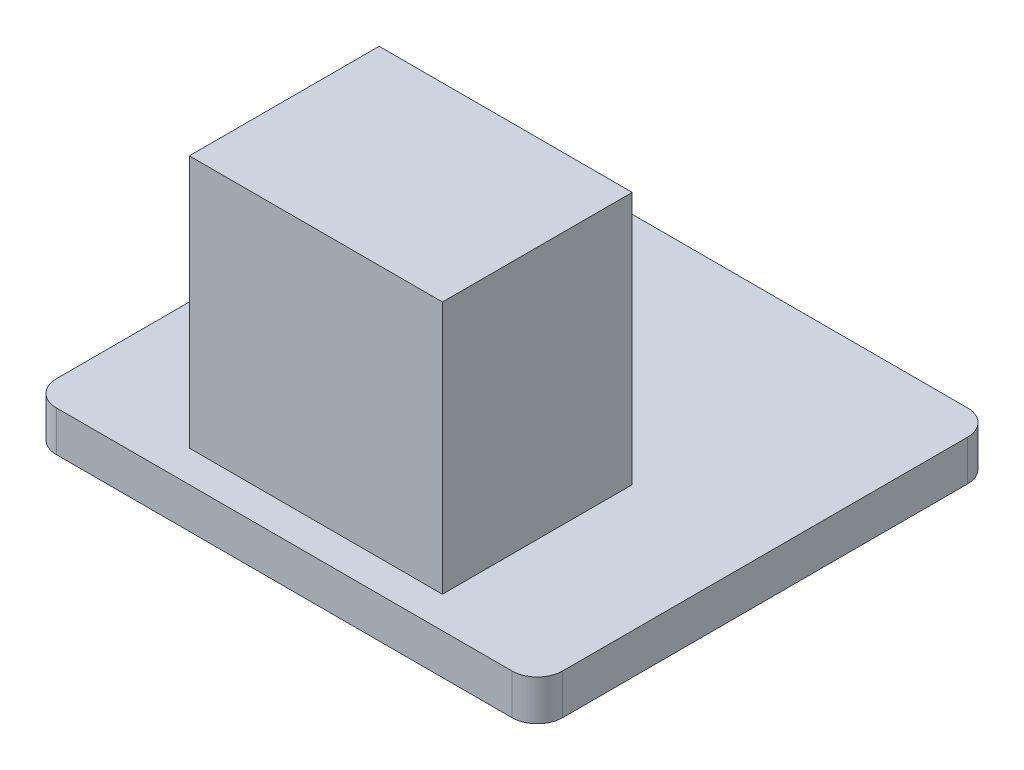
ISO-10303-21;
HEADER;
FILE_DESCRIPTION(('STEP AP214'),'2;1');
FILE_NAME('part.step','',(''),(''),'','','');
FILE_SCHEMA(('AUTOMOTIVE_DESIGN { 1 0 10303 214 1 1 1 1 }'));
ENDSEC;
DATA;
#1=APPLICATION_CONTEXT('core data for automotive mechanical design processes');
#2=APPLICATION_PROTOCOL_DEFINITION('international standard','automotive_design',2000,#1);
#3=PRODUCT_CONTEXT('',#1,'mechanical');
#4=PRODUCT('Part','Part','',(#3));
#5=PRODUCT_RELATED_PRODUCT_CATEGORY('part','',(#4));
#6=PRODUCT_DEFINITION_FORMATION('','',#4);
#7=PRODUCT_DEFINITION_CONTEXT('part definition',#1,'design');
#8=PRODUCT_DEFINITION('design','',#6,#7);
#9=PRODUCT_DEFINITION_SHAPE('','',#8);
#10=(LENGTH_UNIT() NAMED_UNIT(*) SI_UNIT(.MILLI.,.METRE.));
#11=(NAMED_UNIT(*) PLANE_ANGLE_UNIT() SI_UNIT($,.RADIAN.));
#12=(NAMED_UNIT(*) SI_UNIT($,.STERADIAN.) SOLID_ANGLE_UNIT());
#13=UNCERTAINTY_MEASURE_WITH_UNIT(LENGTH_MEASURE(1.E-05),#10,'distance_accuracy_value','');
#14=(GEOMETRIC_REPRESENTATION_CONTEXT(3) GLOBAL_UNCERTAINTY_ASSIGNED_CONTEXT((#13)) GLOBAL_UNIT_ASSIGNED_CONTEXT((#10,
#11,#12)) REPRESENTATION_CONTEXT('',''));
#15=CARTESIAN_POINT('',(0.,0.,0.));
#16=DIRECTION('',(0.,0.,1.));
#17=DIRECTION('',(1.,0.,0.));
#18=AXIS2_PLACEMENT_3D('',#15,#16,#17);
#19=CARTESIAN_POINT('',(-56.,11.6,22.));
#20=DIRECTION('',(0.,-1.,0.));
#21=DIRECTION('',(0.,0.,-1.));
#22=AXIS2_PLACEMENT_3D('',#19,#20,#21);
#23=PLANE('',#22);
#24=CARTESIAN_POINT('',(-56.,11.6,22.));
#25=DIRECTION('',(0.,1.,0.));
#26=DIRECTION('',(0.,0.,-1.));
#27=AXIS2_PLACEMENT_3D('',#24,#25,#26);
#28=CIRCLE('',#27,0.999999999999999);
#29=CARTESIAN_POINT('',(-56.,11.6,21.));
#30=VERTEX_POINT('',#29);
#31=CARTESIAN_POINT('',(-57.,11.6,22.));
#32=VERTEX_POINT('',#31);
#33=EDGE_CURVE('E160',#30,#32,#28,.T.);
#34=ORIENTED_EDGE('',*,*,#33,.T.);
#35=DIRECTION('',(0.,0.,1.));
#36=VECTOR('',#35,1.);
#37=CARTESIAN_POINT('',(-57.,11.6,38.));
#38=LINE('',#37,#36);
#39=CARTESIAN_POINT('',(-57.,11.6,38.));
#40=VERTEX_POINT('',#39);
#41=EDGE_CURVE('E158',#32,#40,#38,.T.);
#42=ORIENTED_EDGE('',*,*,#41,.T.);
#43=CARTESIAN_POINT('',(-56.,11.6,38.));
#44=DIRECTION('',(0.,1.,0.));
#45=DIRECTION('',(0.,0.,-1.));
#46=AXIS2_PLACEMENT_3D('',#43,#44,#45);
#47=CIRCLE('',#46,1.);
#48=CARTESIAN_POINT('',(-56.,11.6,39.));
#49=VERTEX_POINT('',#48);
#50=EDGE_CURVE('E161',#40,#49,#47,.T.);
#51=ORIENTED_EDGE('',*,*,#50,.T.);
#52=DIRECTION('',(1.,0.,0.));
#53=VECTOR('',#52,1.);
#54=CARTESIAN_POINT('',(-38.,11.6,39.));
#55=LINE('',#54,#53);
#56=CARTESIAN_POINT('',(-38.,11.6,39.));
#57=VERTEX_POINT('',#56);
#58=EDGE_CURVE('E164',#49,#57,#55,.T.);
#59=ORIENTED_EDGE('',*,*,#58,.T.);
#60=CARTESIAN_POINT('',(-38.,11.6,38.));
#61=DIRECTION('',(0.,1.,0.));
#62=DIRECTION('',(0.,0.,-1.));
#63=AXIS2_PLACEMENT_3D('',#60,#61,#62);
#64=CIRCLE('',#63,1.);
#65=CARTESIAN_POINT('',(-37.,11.6,38.));
#66=VERTEX_POINT('',#65);
#67=EDGE_CURVE('E167',#57,#66,#64,.T.);
#68=ORIENTED_EDGE('',*,*,#67,.T.);
#69=DIRECTION('',(0.,0.,-1.));
#70=VECTOR('',#69,1.);
#71=CARTESIAN_POINT('',(-37.,11.6,22.));
#72=LINE('',#71,#70);
#73=CARTESIAN_POINT('',(-37.,11.6,22.));
#74=VERTEX_POINT('',#73);
#75=EDGE_CURVE('E170',#66,#74,#72,.T.);
#76=ORIENTED_EDGE('',*,*,#75,.T.);
#77=CARTESIAN_POINT('',(-38.,11.6,22.));
#78=DIRECTION('',(0.,1.,0.));
#79=DIRECTION('',(0.,0.,-1.));
#80=AXIS2_PLACEMENT_3D('',#77,#78,#79);
#81=CIRCLE('',#80,0.999999999999999);
#82=CARTESIAN_POINT('',(-38.,11.6,21.));
#83=VERTEX_POINT('',#82);
#84=EDGE_CURVE('E173',#74,#83,#81,.T.);
#85=ORIENTED_EDGE('',*,*,#84,.T.);
#86=DIRECTION('',(-1.,0.,0.));
#87=VECTOR('',#86,1.);
#88=CARTESIAN_POINT('',(-56.,11.6,21.));
#89=LINE('',#88,#87);
#90=EDGE_CURVE('E171',#83,#30,#89,.T.);
#91=ORIENTED_EDGE('',*,*,#90,.T.);
#92=EDGE_LOOP('',(#34,#42,#51,#59,#68,#76,#85,#91));
#93=FACE_BOUND('',#92,.T.);
#94=DIRECTION('',(0.,0.,1.));
#95=VECTOR('',#94,1.);
#96=CARTESIAN_POINT('',(-52.,11.6,37.75));
#97=LINE('',#96,#95);
#98=CARTESIAN_POINT('',(-52.,11.6,30.25));
#99=VERTEX_POINT('',#98);
#100=CARTESIAN_POINT('',(-52.,11.6,37.75));
#101=VERTEX_POINT('',#100);
#102=EDGE_CURVE('E53',#99,#101,#97,.T.);
#103=ORIENTED_EDGE('',*,*,#102,.F.);
#104=DIRECTION('',(-1.,0.,0.));
#105=VECTOR('',#104,1.);
#106=CARTESIAN_POINT('',(-52.,11.6,30.25));
#107=LINE('',#106,#105);
#108=CARTESIAN_POINT('',(-42.,11.6,30.25));
#109=VERTEX_POINT('',#108);
#110=EDGE_CURVE('E59',#109,#99,#107,.T.);
#111=ORIENTED_EDGE('',*,*,#110,.F.);
#112=DIRECTION('',(0.,0.,-1.));
#113=VECTOR('',#112,1.);
#114=CARTESIAN_POINT('',(-42.,11.6,30.25));
#115=LINE('',#114,#113);
#116=CARTESIAN_POINT('',(-42.,11.6,37.75));
#117=VERTEX_POINT('',#116);
#118=EDGE_CURVE('E327',#117,#109,#115,.T.);
#119=ORIENTED_EDGE('',*,*,#118,.F.);
#120=DIRECTION('',(1.,0.,0.));
#121=VECTOR('',#120,1.);
#122=CARTESIAN_POINT('',(-42.,11.6,37.75));
#123=LINE('',#122,#121);
#124=EDGE_CURVE('E335',#101,#117,#123,.T.);
#125=ORIENTED_EDGE('',*,*,#124,.F.);
#126=EDGE_LOOP('',(#103,#111,#119,#125));
#127=FACE_BOUND('',#126,.T.);
#128=ADVANCED_FACE('F39',(#93,#127),#23,.F.);
#129=CARTESIAN_POINT('',(-56.,11.6,22.));
#130=DIRECTION('',(0.,-1.,0.));
#131=DIRECTION('',(0.,0.,-1.));
#132=AXIS2_PLACEMENT_3D('',#129,#130,#131);
#133=CYLINDRICAL_SURFACE('',#132,0.999999999999999);
#134=CARTESIAN_POINT('',(-56.,10.,22.));
#135=DIRECTION('',(0.,1.,0.));
#136=DIRECTION('',(0.,0.,-1.));
#137=AXIS2_PLACEMENT_3D('',#134,#135,#136);
#138=CIRCLE('',#137,0.999999999999999);
#139=CARTESIAN_POINT('',(-56.,10.,21.));
#140=VERTEX_POINT('',#139);
#141=CARTESIAN_POINT('',(-57.,10.,22.));
#142=VERTEX_POINT('',#141);
#143=EDGE_CURVE('E149',#140,#142,#138,.T.);
#144=ORIENTED_EDGE('',*,*,#143,.T.);
#145=DIRECTION('',(0.,-1.,0.));
#146=VECTOR('',#145,1.);
#147=CARTESIAN_POINT('',(-57.,11.6,22.));
#148=LINE('',#147,#146);
#149=EDGE_CURVE('E11',#32,#142,#148,.T.);
#150=ORIENTED_EDGE('',*,*,#149,.F.);
#151=ORIENTED_EDGE('',*,*,#33,.F.);
#152=DIRECTION('',(0.,-1.,0.));
#153=VECTOR('',#152,1.);
#154=CARTESIAN_POINT('',(-56.,11.6,21.));
#155=LINE('',#154,#153);
#156=EDGE_CURVE('E174',#30,#140,#155,.T.);
#157=ORIENTED_EDGE('',*,*,#156,.T.);
#158=EDGE_LOOP('',(#144,#150,#151,#157));
#159=FACE_BOUND('',#158,.T.);
#160=ADVANCED_FACE('F41',(#159),#133,.T.);
#161=CARTESIAN_POINT('',(-57.,11.6,38.));
#162=DIRECTION('',(1.,0.,0.));
#163=DIRECTION('',(0.,0.,-1.));
#164=AXIS2_PLACEMENT_3D('',#161,#162,#163);
#165=PLANE('',#164);
#166=DIRECTION('',(0.,0.,1.));
#167=VECTOR('',#166,1.);
#168=CARTESIAN_POINT('',(-57.,10.,38.));
#169=LINE('',#168,#167);
#170=CARTESIAN_POINT('',(-57.,10.,38.));
#171=VERTEX_POINT('',#170);
#172=EDGE_CURVE('E153',#142,#171,#169,.T.);
#173=ORIENTED_EDGE('',*,*,#172,.T.);
#174=DIRECTION('',(0.,-1.,0.));
#175=VECTOR('',#174,1.);
#176=CARTESIAN_POINT('',(-57.,11.6,38.));
#177=LINE('',#176,#175);
#178=EDGE_CURVE('E50',#40,#171,#177,.T.);
#179=ORIENTED_EDGE('',*,*,#178,.F.);
#180=ORIENTED_EDGE('',*,*,#41,.F.);
#181=ORIENTED_EDGE('',*,*,#149,.T.);
#182=EDGE_LOOP('',(#173,#179,#180,#181));
#183=FACE_BOUND('',#182,.T.);
#184=ADVANCED_FACE('F231',(#183),#165,.F.);
#185=CARTESIAN_POINT('',(-56.,11.6,38.));
#186=DIRECTION('',(0.,-1.,0.));
#187=DIRECTION('',(0.,0.,-1.));
#188=AXIS2_PLACEMENT_3D('',#185,#186,#187);
#189=CYLINDRICAL_SURFACE('',#188,1.);
#190=CARTESIAN_POINT('',(-56.,10.,38.));
#191=DIRECTION('',(0.,1.,0.));
#192=DIRECTION('',(0.,0.,-1.));
#193=AXIS2_PLACEMENT_3D('',#190,#191,#192);
#194=CIRCLE('',#193,1.);
#195=CARTESIAN_POINT('',(-56.,10.,39.));
#196=VERTEX_POINT('',#195);
#197=EDGE_CURVE('E180',#171,#196,#194,.T.);
#198=ORIENTED_EDGE('',*,*,#197,.T.);
#199=DIRECTION('',(0.,-1.,0.));
#200=VECTOR('',#199,1.);
#201=CARTESIAN_POINT('',(-56.,11.6,39.));
#202=LINE('',#201,#200);
#203=EDGE_CURVE('E205',#49,#196,#202,.T.);
#204=ORIENTED_EDGE('',*,*,#203,.F.);
#205=ORIENTED_EDGE('',*,*,#50,.F.);
#206=ORIENTED_EDGE('',*,*,#178,.T.);
#207=EDGE_LOOP('',(#198,#204,#205,#206));
#208=FACE_BOUND('',#207,.T.);
#209=ADVANCED_FACE('F207',(#208),#189,.T.);
#210=CARTESIAN_POINT('',(-38.,11.6,39.));
#211=DIRECTION('',(0.,0.,-1.));
#212=DIRECTION('',(-1.,0.,0.));
#213=AXIS2_PLACEMENT_3D('',#210,#211,#212);
#214=PLANE('',#213);
#215=DIRECTION('',(1.,0.,0.));
#216=VECTOR('',#215,1.);
#217=CARTESIAN_POINT('',(-38.,10.,39.));
#218=LINE('',#217,#216);
#219=CARTESIAN_POINT('',(-38.,10.,39.));
#220=VERTEX_POINT('',#219);
#221=EDGE_CURVE('E177',#196,#220,#218,.T.);
#222=ORIENTED_EDGE('',*,*,#221,.T.);
#223=DIRECTION('',(0.,-1.,0.));
#224=VECTOR('',#223,1.);
#225=CARTESIAN_POINT('',(-38.,11.6,39.));
#226=LINE('',#225,#224);
#227=EDGE_CURVE('E197',#57,#220,#226,.T.);
#228=ORIENTED_EDGE('',*,*,#227,.F.);
#229=ORIENTED_EDGE('',*,*,#58,.F.);
#230=ORIENTED_EDGE('',*,*,#203,.T.);
#231=EDGE_LOOP('',(#222,#228,#229,#230));
#232=FACE_BOUND('',#231,.T.);
#233=ADVANCED_FACE('F217',(#232),#214,.F.);
#234=CARTESIAN_POINT('',(-38.,11.6,38.));
#235=DIRECTION('',(0.,-1.,0.));
#236=DIRECTION('',(0.,0.,-1.));
#237=AXIS2_PLACEMENT_3D('',#234,#235,#236);
#238=CYLINDRICAL_SURFACE('',#237,1.);
#239=CARTESIAN_POINT('',(-38.,10.,38.));
#240=DIRECTION('',(0.,1.,0.));
#241=DIRECTION('',(0.,0.,-1.));
#242=AXIS2_PLACEMENT_3D('',#239,#240,#241);
#243=CIRCLE('',#242,1.);
#244=CARTESIAN_POINT('',(-37.,10.,38.));
#245=VERTEX_POINT('',#244);
#246=EDGE_CURVE('E181',#220,#245,#243,.T.);
#247=ORIENTED_EDGE('',*,*,#246,.T.);
#248=DIRECTION('',(0.,-1.,0.));
#249=VECTOR('',#248,1.);
#250=CARTESIAN_POINT('',(-37.,11.6,38.));
#251=LINE('',#250,#249);
#252=EDGE_CURVE('E198',#66,#245,#251,.T.);
#253=ORIENTED_EDGE('',*,*,#252,.F.);
#254=ORIENTED_EDGE('',*,*,#67,.F.);
#255=ORIENTED_EDGE('',*,*,#227,.T.);
#256=EDGE_LOOP('',(#247,#253,#254,#255));
#257=FACE_BOUND('',#256,.T.);
#258=ADVANCED_FACE('F222',(#257),#238,.T.);
#259=CARTESIAN_POINT('',(-37.,11.6,22.));
#260=DIRECTION('',(-1.,0.,0.));
#261=DIRECTION('',(0.,0.,1.));
#262=AXIS2_PLACEMENT_3D('',#259,#260,#261);
#263=PLANE('',#262);
#264=DIRECTION('',(0.,0.,-1.));
#265=VECTOR('',#264,1.);
#266=CARTESIAN_POINT('',(-37.,10.,22.));
#267=LINE('',#266,#265);
#268=CARTESIAN_POINT('',(-37.,10.,22.));
#269=VERTEX_POINT('',#268);
#270=EDGE_CURVE('E183',#245,#269,#267,.T.);
#271=ORIENTED_EDGE('',*,*,#270,.T.);
#272=DIRECTION('',(0.,-1.,0.));
#273=VECTOR('',#272,1.);
#274=CARTESIAN_POINT('',(-37.,11.6,22.));
#275=LINE('',#274,#273);
#276=EDGE_CURVE('E194',#74,#269,#275,.T.);
#277=ORIENTED_EDGE('',*,*,#276,.F.);
#278=ORIENTED_EDGE('',*,*,#75,.F.);
#279=ORIENTED_EDGE('',*,*,#252,.T.);
#280=EDGE_LOOP('',(#271,#277,#278,#279));
#281=FACE_BOUND('',#280,.T.);
#282=ADVANCED_FACE('F242',(#281),#263,.F.);
#283=CARTESIAN_POINT('',(-38.,11.6,22.));
#284=DIRECTION('',(0.,-1.,0.));
#285=DIRECTION('',(0.,0.,-1.));
#286=AXIS2_PLACEMENT_3D('',#283,#284,#285);
#287=CYLINDRICAL_SURFACE('',#286,0.999999999999999);
#288=CARTESIAN_POINT('',(-38.,10.,22.));
#289=DIRECTION('',(0.,1.,0.));
#290=DIRECTION('',(0.,0.,-1.));
#291=AXIS2_PLACEMENT_3D('',#288,#289,#290);
#292=CIRCLE('',#291,0.999999999999999);
#293=CARTESIAN_POINT('',(-38.,10.,21.));
#294=VERTEX_POINT('',#293);
#295=EDGE_CURVE('E184',#269,#294,#292,.T.);
#296=ORIENTED_EDGE('',*,*,#295,.T.);
#297=DIRECTION('',(0.,-1.,0.));
#298=VECTOR('',#297,1.);
#299=CARTESIAN_POINT('',(-38.,11.6,21.));
#300=LINE('',#299,#298);
#301=EDGE_CURVE('E189',#83,#294,#300,.T.);
#302=ORIENTED_EDGE('',*,*,#301,.F.);
#303=ORIENTED_EDGE('',*,*,#84,.F.);
#304=ORIENTED_EDGE('',*,*,#276,.T.);
#305=EDGE_LOOP('',(#296,#302,#303,#304));
#306=FACE_BOUND('',#305,.T.);
#307=ADVANCED_FACE('F245',(#306),#287,.T.);
#308=CARTESIAN_POINT('',(-56.,11.6,21.));
#309=DIRECTION('',(0.,0.,1.));
#310=DIRECTION('',(1.,0.,0.));
#311=AXIS2_PLACEMENT_3D('',#308,#309,#310);
#312=PLANE('',#311);
#313=DIRECTION('',(-1.,0.,0.));
#314=VECTOR('',#313,1.);
#315=CARTESIAN_POINT('',(-56.,10.,21.));
#316=LINE('',#315,#314);
#317=EDGE_CURVE('E163',#294,#140,#316,.T.);
#318=ORIENTED_EDGE('',*,*,#317,.T.);
#319=ORIENTED_EDGE('',*,*,#156,.F.);
#320=ORIENTED_EDGE('',*,*,#90,.F.);
#321=ORIENTED_EDGE('',*,*,#301,.T.);
#322=EDGE_LOOP('',(#318,#319,#320,#321));
#323=FACE_BOUND('',#322,.T.);
#324=ADVANCED_FACE('F240',(#323),#312,.F.);
#325=CARTESIAN_POINT('',(-56.,10.,22.));
#326=DIRECTION('',(0.,-1.,0.));
#327=DIRECTION('',(0.,0.,-1.));
#328=AXIS2_PLACEMENT_3D('',#325,#326,#327);
#329=PLANE('',#328);
#330=ORIENTED_EDGE('',*,*,#143,.F.);
#331=ORIENTED_EDGE('',*,*,#317,.F.);
#332=ORIENTED_EDGE('',*,*,#295,.F.);
#333=ORIENTED_EDGE('',*,*,#270,.F.);
#334=ORIENTED_EDGE('',*,*,#246,.F.);
#335=ORIENTED_EDGE('',*,*,#221,.F.);
#336=ORIENTED_EDGE('',*,*,#197,.F.);
#337=ORIENTED_EDGE('',*,*,#172,.F.);
#338=EDGE_LOOP('',(#330,#331,#332,#333,#334,#335,#336,#337));
#339=FACE_BOUND('',#338,.T.);
#340=ADVANCED_FACE('F214',(#339),#329,.T.);
#341=CARTESIAN_POINT('',(-52.,21.6,37.75));
#342=DIRECTION('',(1.,0.,0.));
#343=DIRECTION('',(0.,0.,-1.));
#344=AXIS2_PLACEMENT_3D('',#341,#342,#343);
#345=PLANE('',#344);
#346=ORIENTED_EDGE('',*,*,#102,.T.);
#347=DIRECTION('',(0.,-1.,0.));
#348=VECTOR('',#347,1.);
#349=CARTESIAN_POINT('',(-52.,21.6,37.75));
#350=LINE('',#349,#348);
#351=CARTESIAN_POINT('',(-52.,21.6,37.75));
#352=VERTEX_POINT('',#351);
#353=EDGE_CURVE('E131',#352,#101,#350,.T.);
#354=ORIENTED_EDGE('',*,*,#353,.F.);
#355=DIRECTION('',(0.,0.,1.));
#356=VECTOR('',#355,1.);
#357=CARTESIAN_POINT('',(-52.,21.6,37.75));
#358=LINE('',#357,#356);
#359=CARTESIAN_POINT('',(-52.,21.6,30.25));
#360=VERTEX_POINT('',#359);
#361=EDGE_CURVE('E140',#360,#352,#358,.T.);
#362=ORIENTED_EDGE('',*,*,#361,.F.);
#363=DIRECTION('',(0.,-1.,0.));
#364=VECTOR('',#363,1.);
#365=CARTESIAN_POINT('',(-52.,21.6,30.25));
#366=LINE('',#365,#364);
#367=EDGE_CURVE('E323',#360,#99,#366,.T.);
#368=ORIENTED_EDGE('',*,*,#367,.T.);
#369=EDGE_LOOP('',(#346,#354,#362,#368));
#370=FACE_BOUND('',#369,.T.);
#371=ADVANCED_FACE('F150',(#370),#345,.F.);
#372=CARTESIAN_POINT('',(-42.,21.6,37.75));
#373=DIRECTION('',(0.,0.,-1.));
#374=DIRECTION('',(-1.,0.,0.));
#375=AXIS2_PLACEMENT_3D('',#372,#373,#374);
#376=PLANE('',#375);
#377=ORIENTED_EDGE('',*,*,#124,.T.);
#378=DIRECTION('',(0.,-1.,0.));
#379=VECTOR('',#378,1.);
#380=CARTESIAN_POINT('',(-42.,21.6,37.75));
#381=LINE('',#380,#379);
#382=CARTESIAN_POINT('',(-42.,21.6,37.75));
#383=VERTEX_POINT('',#382);
#384=EDGE_CURVE('E133',#383,#117,#381,.T.);
#385=ORIENTED_EDGE('',*,*,#384,.F.);
#386=DIRECTION('',(1.,0.,0.));
#387=VECTOR('',#386,1.);
#388=CARTESIAN_POINT('',(-42.,21.6,37.75));
#389=LINE('',#388,#387);
#390=EDGE_CURVE('E128',#352,#383,#389,.T.);
#391=ORIENTED_EDGE('',*,*,#390,.F.);
#392=ORIENTED_EDGE('',*,*,#353,.T.);
#393=EDGE_LOOP('',(#377,#385,#391,#392));
#394=FACE_BOUND('',#393,.T.);
#395=ADVANCED_FACE('F129',(#394),#376,.F.);
#396=CARTESIAN_POINT('',(-42.,21.6,30.25));
#397=DIRECTION('',(-1.,0.,0.));
#398=DIRECTION('',(0.,0.,1.));
#399=AXIS2_PLACEMENT_3D('',#396,#397,#398);
#400=PLANE('',#399);
#401=ORIENTED_EDGE('',*,*,#118,.T.);
#402=DIRECTION('',(0.,-1.,0.));
#403=VECTOR('',#402,1.);
#404=CARTESIAN_POINT('',(-42.,21.6,30.25));
#405=LINE('',#404,#403);
#406=CARTESIAN_POINT('',(-42.,21.6,30.25));
#407=VERTEX_POINT('',#406);
#408=EDGE_CURVE('E151',#407,#109,#405,.T.);
#409=ORIENTED_EDGE('',*,*,#408,.F.);
#410=DIRECTION('',(0.,0.,-1.));
#411=VECTOR('',#410,1.);
#412=CARTESIAN_POINT('',(-42.,21.6,30.25));
#413=LINE('',#412,#411);
#414=EDGE_CURVE('E136',#383,#407,#413,.T.);
#415=ORIENTED_EDGE('',*,*,#414,.F.);
#416=ORIENTED_EDGE('',*,*,#384,.T.);
#417=EDGE_LOOP('',(#401,#409,#415,#416));
#418=FACE_BOUND('',#417,.T.);
#419=ADVANCED_FACE('F294',(#418),#400,.F.);
#420=CARTESIAN_POINT('',(-52.,21.6,30.25));
#421=DIRECTION('',(0.,0.,1.));
#422=DIRECTION('',(1.,0.,0.));
#423=AXIS2_PLACEMENT_3D('',#420,#421,#422);
#424=PLANE('',#423);
#425=ORIENTED_EDGE('',*,*,#110,.T.);
#426=ORIENTED_EDGE('',*,*,#367,.F.);
#427=DIRECTION('',(-1.,0.,0.));
#428=VECTOR('',#427,1.);
#429=CARTESIAN_POINT('',(-52.,21.6,30.25));
#430=LINE('',#429,#428);
#431=EDGE_CURVE('E145',#407,#360,#430,.T.);
#432=ORIENTED_EDGE('',*,*,#431,.F.);
#433=ORIENTED_EDGE('',*,*,#408,.T.);
#434=EDGE_LOOP('',(#425,#426,#432,#433));
#435=FACE_BOUND('',#434,.T.);
#436=ADVANCED_FACE('F302',(#435),#424,.F.);
#437=CARTESIAN_POINT('',(0.,21.6,0.));
#438=DIRECTION('',(0.,-1.,0.));
#439=DIRECTION('',(0.,0.,-1.));
#440=AXIS2_PLACEMENT_3D('',#437,#438,#439);
#441=PLANE('',#440);
#442=ORIENTED_EDGE('',*,*,#361,.T.);
#443=ORIENTED_EDGE('',*,*,#390,.T.);
#444=ORIENTED_EDGE('',*,*,#414,.T.);
#445=ORIENTED_EDGE('',*,*,#431,.T.);
#446=EDGE_LOOP('',(#442,#443,#444,#445));
#447=FACE_BOUND('',#446,.T.);
#448=ADVANCED_FACE('F139',(#447),#441,.F.);
#449=CLOSED_SHELL('',(#128,#160,#184,#209,#233,#258,#282,#307,#324,#340,#371,#395,#419,#436,#448));
#450=MANIFOLD_SOLID_BREP('B2',#449);
#451=ADVANCED_BREP_SHAPE_REPRESENTATION('',(#18,#450),#14);
#452=SHAPE_DEFINITION_REPRESENTATION(#9,#451);
ENDSEC;
END-ISO-10303-21;
